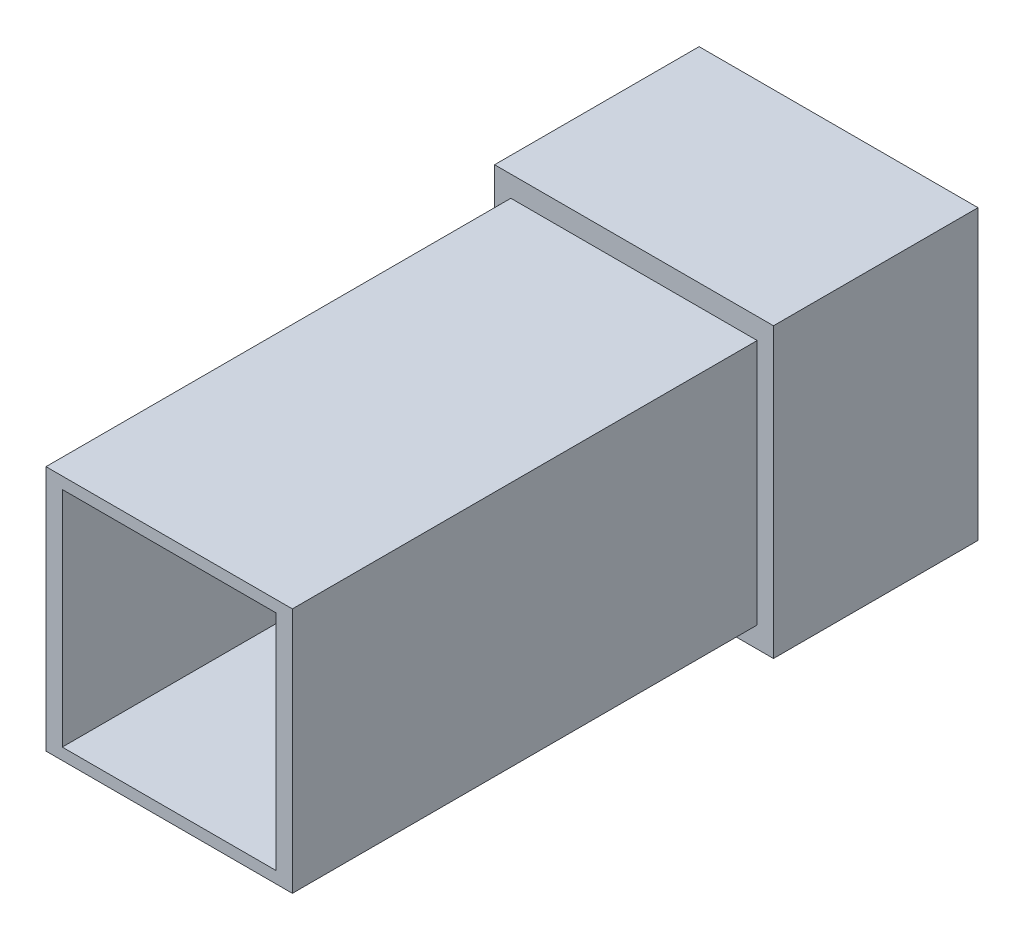
ISO-10303-21;
HEADER;
FILE_DESCRIPTION(('STEP AP214'),'2;1');
FILE_NAME('part.step','',(''),(''),'','','');
FILE_SCHEMA(('AUTOMOTIVE_DESIGN { 1 0 10303 214 1 1 1 1 }'));
ENDSEC;
DATA;
#1=APPLICATION_CONTEXT('core data for automotive mechanical design processes');
#2=APPLICATION_PROTOCOL_DEFINITION('international standard','automotive_design',2000,#1);
#3=PRODUCT_CONTEXT('',#1,'mechanical');
#4=PRODUCT('Part','Part','',(#3));
#5=PRODUCT_RELATED_PRODUCT_CATEGORY('part','',(#4));
#6=PRODUCT_DEFINITION_FORMATION('','',#4);
#7=PRODUCT_DEFINITION_CONTEXT('part definition',#1,'design');
#8=PRODUCT_DEFINITION('design','',#6,#7);
#9=PRODUCT_DEFINITION_SHAPE('','',#8);
#10=(LENGTH_UNIT() NAMED_UNIT(*) SI_UNIT(.MILLI.,.METRE.));
#11=(NAMED_UNIT(*) PLANE_ANGLE_UNIT() SI_UNIT($,.RADIAN.));
#12=(NAMED_UNIT(*) SI_UNIT($,.STERADIAN.) SOLID_ANGLE_UNIT());
#13=UNCERTAINTY_MEASURE_WITH_UNIT(LENGTH_MEASURE(1.E-05),#10,'distance_accuracy_value','');
#14=(GEOMETRIC_REPRESENTATION_CONTEXT(3) GLOBAL_UNCERTAINTY_ASSIGNED_CONTEXT((#13)) GLOBAL_UNIT_ASSIGNED_CONTEXT((#10,
#11,#12)) REPRESENTATION_CONTEXT('',''));
#15=CARTESIAN_POINT('',(0.,0.,0.));
#16=DIRECTION('',(0.,0.,1.));
#17=DIRECTION('',(1.,0.,0.));
#18=AXIS2_PLACEMENT_3D('',#15,#16,#17);
#19=CARTESIAN_POINT('',(0.,0.,55.88));
#20=DIRECTION('',(0.,0.,1.));
#21=DIRECTION('',(1.,0.,0.));
#22=AXIS2_PLACEMENT_3D('',#19,#20,#21);
#23=PLANE('',#22);
#24=DIRECTION('',(0.,-1.,0.));
#25=VECTOR('',#24,1.);
#26=CARTESIAN_POINT('',(-3.81,74.93,55.88));
#27=LINE('',#26,#25);
#28=CARTESIAN_POINT('',(-3.81,74.93,55.88));
#29=VERTEX_POINT('',#28);
#30=CARTESIAN_POINT('',(-3.81,-3.81,55.88));
#31=VERTEX_POINT('',#30);
#32=EDGE_CURVE('E340',#29,#31,#27,.T.);
#33=ORIENTED_EDGE('',*,*,#32,.T.);
#34=DIRECTION('',(1.,0.,0.));
#35=VECTOR('',#34,1.);
#36=CARTESIAN_POINT('',(-3.81,-3.81,55.88));
#37=LINE('',#36,#35);
#38=CARTESIAN_POINT('',(72.39,-3.81,55.88));
#39=VERTEX_POINT('',#38);
#40=EDGE_CURVE('E344',#31,#39,#37,.T.);
#41=ORIENTED_EDGE('',*,*,#40,.T.);
#42=DIRECTION('',(0.,1.,0.));
#43=VECTOR('',#42,1.);
#44=CARTESIAN_POINT('',(72.39,74.93,55.88));
#45=LINE('',#44,#43);
#46=CARTESIAN_POINT('',(72.39,74.93,55.88));
#47=VERTEX_POINT('',#46);
#48=EDGE_CURVE('E348',#39,#47,#45,.T.);
#49=ORIENTED_EDGE('',*,*,#48,.T.);
#50=DIRECTION('',(-1.,0.,0.));
#51=VECTOR('',#50,1.);
#52=CARTESIAN_POINT('',(-3.81,74.93,55.88));
#53=LINE('',#52,#51);
#54=EDGE_CURVE('E352',#47,#29,#53,.T.);
#55=ORIENTED_EDGE('',*,*,#54,.T.);
#56=EDGE_LOOP('',(#33,#41,#49,#55));
#57=FACE_BOUND('',#56,.T.);
#58=DIRECTION('',(1.,0.,0.));
#59=VECTOR('',#58,1.);
#60=CARTESIAN_POINT('',(0.634999999999986,1.90500000000001,55.88));
#61=LINE('',#60,#59);
#62=CARTESIAN_POINT('',(0.634999999999986,1.90500000000001,55.88));
#63=VERTEX_POINT('',#62);
#64=CARTESIAN_POINT('',(67.945,1.905,55.88));
#65=VERTEX_POINT('',#64);
#66=EDGE_CURVE('E260',#63,#65,#61,.T.);
#67=ORIENTED_EDGE('',*,*,#66,.F.);
#68=DIRECTION('',(0.,-1.,0.));
#69=VECTOR('',#68,1.);
#70=CARTESIAN_POINT('',(0.634999999999999,69.215,55.88));
#71=LINE('',#70,#69);
#72=CARTESIAN_POINT('',(0.634999999999999,69.215,55.88));
#73=VERTEX_POINT('',#72);
#74=EDGE_CURVE('E241',#73,#63,#71,.T.);
#75=ORIENTED_EDGE('',*,*,#74,.F.);
#76=DIRECTION('',(-1.,0.,0.));
#77=VECTOR('',#76,1.);
#78=CARTESIAN_POINT('',(0.634999999999999,69.215,55.88));
#79=LINE('',#78,#77);
#80=CARTESIAN_POINT('',(67.945,69.215,55.88));
#81=VERTEX_POINT('',#80);
#82=EDGE_CURVE('E247',#81,#73,#79,.T.);
#83=ORIENTED_EDGE('',*,*,#82,.F.);
#84=DIRECTION('',(0.,1.,0.));
#85=VECTOR('',#84,1.);
#86=CARTESIAN_POINT('',(67.945,69.215,55.88));
#87=LINE('',#86,#85);
#88=EDGE_CURVE('E263',#65,#81,#87,.T.);
#89=ORIENTED_EDGE('',*,*,#88,.F.);
#90=EDGE_LOOP('',(#67,#75,#83,#89));
#91=FACE_BOUND('',#90,.T.);
#92=ADVANCED_FACE('F67',(#57,#91),#23,.T.);
#93=CARTESIAN_POINT('',(68.58,0.,50.8));
#94=DIRECTION('',(-1.,0.,0.));
#95=DIRECTION('',(0.,0.,1.));
#96=AXIS2_PLACEMENT_3D('',#93,#94,#95);
#97=PLANE('',#96);
#98=DIRECTION('',(0.,1.,0.));
#99=VECTOR('',#98,1.);
#100=CARTESIAN_POINT('',(68.58,0.,0.));
#101=LINE('',#100,#99);
#102=CARTESIAN_POINT('',(68.58,0.,0.));
#103=VERTEX_POINT('',#102);
#104=CARTESIAN_POINT('',(68.58,71.12,0.));
#105=VERTEX_POINT('',#104);
#106=EDGE_CURVE('E388',#103,#105,#101,.T.);
#107=ORIENTED_EDGE('',*,*,#106,.F.);
#108=DIRECTION('',(0.,0.,-1.));
#109=VECTOR('',#108,1.);
#110=CARTESIAN_POINT('',(68.58,0.,50.8));
#111=LINE('',#110,#109);
#112=CARTESIAN_POINT('',(68.58,0.,50.8));
#113=VERTEX_POINT('',#112);
#114=EDGE_CURVE('E12',#113,#103,#111,.T.);
#115=ORIENTED_EDGE('',*,*,#114,.F.);
#116=DIRECTION('',(0.,1.,0.));
#117=VECTOR('',#116,1.);
#118=CARTESIAN_POINT('',(68.58,0.,50.8));
#119=LINE('',#118,#117);
#120=CARTESIAN_POINT('',(68.58,71.12,50.8));
#121=VERTEX_POINT('',#120);
#122=EDGE_CURVE('E357',#113,#121,#119,.T.);
#123=ORIENTED_EDGE('',*,*,#122,.T.);
#124=DIRECTION('',(0.,0.,-1.));
#125=VECTOR('',#124,1.);
#126=CARTESIAN_POINT('',(68.58,71.12,50.8));
#127=LINE('',#126,#125);
#128=EDGE_CURVE('E403',#121,#105,#127,.T.);
#129=ORIENTED_EDGE('',*,*,#128,.T.);
#130=EDGE_LOOP('',(#107,#115,#123,#129));
#131=FACE_BOUND('',#130,.T.);
#132=ADVANCED_FACE('F441',(#131),#97,.T.);
#133=CARTESIAN_POINT('',(0.,0.,50.8));
#134=DIRECTION('',(0.,1.,0.));
#135=DIRECTION('',(0.,0.,1.));
#136=AXIS2_PLACEMENT_3D('',#133,#134,#135);
#137=PLANE('',#136);
#138=DIRECTION('',(1.,0.,0.));
#139=VECTOR('',#138,1.);
#140=CARTESIAN_POINT('',(0.,0.,0.));
#141=LINE('',#140,#139);
#142=CARTESIAN_POINT('',(0.,0.,0.));
#143=VERTEX_POINT('',#142);
#144=EDGE_CURVE('E392',#143,#103,#141,.T.);
#145=ORIENTED_EDGE('',*,*,#144,.F.);
#146=DIRECTION('',(0.,0.,-1.));
#147=VECTOR('',#146,1.);
#148=CARTESIAN_POINT('',(0.,0.,50.8));
#149=LINE('',#148,#147);
#150=CARTESIAN_POINT('',(0.,0.,50.8));
#151=VERTEX_POINT('',#150);
#152=EDGE_CURVE('E77',#151,#143,#149,.T.);
#153=ORIENTED_EDGE('',*,*,#152,.F.);
#154=DIRECTION('',(1.,0.,0.));
#155=VECTOR('',#154,1.);
#156=CARTESIAN_POINT('',(0.,0.,50.8));
#157=LINE('',#156,#155);
#158=EDGE_CURVE('E360',#151,#113,#157,.T.);
#159=ORIENTED_EDGE('',*,*,#158,.T.);
#160=ORIENTED_EDGE('',*,*,#114,.T.);
#161=EDGE_LOOP('',(#145,#153,#159,#160));
#162=FACE_BOUND('',#161,.T.);
#163=ADVANCED_FACE('F516',(#162),#137,.T.);
#164=CARTESIAN_POINT('',(0.,0.,50.8));
#165=DIRECTION('',(-1.,0.,0.));
#166=DIRECTION('',(0.,0.,1.));
#167=AXIS2_PLACEMENT_3D('',#164,#165,#166);
#168=PLANE('',#167);
#169=DIRECTION('',(0.,1.,0.));
#170=VECTOR('',#169,1.);
#171=CARTESIAN_POINT('',(0.,0.,0.));
#172=LINE('',#171,#170);
#173=CARTESIAN_POINT('',(0.,71.12,0.));
#174=VERTEX_POINT('',#173);
#175=EDGE_CURVE('E396',#143,#174,#172,.T.);
#176=ORIENTED_EDGE('',*,*,#175,.T.);
#177=DIRECTION('',(0.,0.,-1.));
#178=VECTOR('',#177,1.);
#179=CARTESIAN_POINT('',(0.,71.12,50.8));
#180=LINE('',#179,#178);
#181=CARTESIAN_POINT('',(0.,71.12,50.8));
#182=VERTEX_POINT('',#181);
#183=EDGE_CURVE('E406',#182,#174,#180,.T.);
#184=ORIENTED_EDGE('',*,*,#183,.F.);
#185=DIRECTION('',(0.,1.,0.));
#186=VECTOR('',#185,1.);
#187=CARTESIAN_POINT('',(0.,0.,50.8));
#188=LINE('',#187,#186);
#189=EDGE_CURVE('E365',#151,#182,#188,.T.);
#190=ORIENTED_EDGE('',*,*,#189,.F.);
#191=ORIENTED_EDGE('',*,*,#152,.T.);
#192=EDGE_LOOP('',(#176,#184,#190,#191));
#193=FACE_BOUND('',#192,.T.);
#194=ADVANCED_FACE('F513',(#193),#168,.F.);
#195=CARTESIAN_POINT('',(72.39,0.,50.8));
#196=DIRECTION('',(1.,0.,0.));
#197=DIRECTION('',(0.,1.,0.));
#198=AXIS2_PLACEMENT_3D('',#195,#196,#197);
#199=PLANE('',#198);
#200=DIRECTION('',(0.,-1.,0.));
#201=VECTOR('',#200,1.);
#202=CARTESIAN_POINT('',(72.39,0.,0.));
#203=LINE('',#202,#201);
#204=CARTESIAN_POINT('',(72.39,74.93,0.));
#205=VERTEX_POINT('',#204);
#206=CARTESIAN_POINT('',(72.39,-3.81,0.));
#207=VERTEX_POINT('',#206);
#208=EDGE_CURVE('E356',#205,#207,#203,.T.);
#209=ORIENTED_EDGE('',*,*,#208,.F.);
#210=DIRECTION('',(0.,0.,-1.));
#211=VECTOR('',#210,1.);
#212=CARTESIAN_POINT('',(72.39,74.93,50.8));
#213=LINE('',#212,#211);
#214=EDGE_CURVE('E71',#47,#205,#213,.T.);
#215=ORIENTED_EDGE('',*,*,#214,.F.);
#216=ORIENTED_EDGE('',*,*,#48,.F.);
#217=DIRECTION('',(0.,0.,-1.));
#218=VECTOR('',#217,1.);
#219=CARTESIAN_POINT('',(72.39,-3.81,50.8));
#220=LINE('',#219,#218);
#221=EDGE_CURVE('E373',#39,#207,#220,.T.);
#222=ORIENTED_EDGE('',*,*,#221,.T.);
#223=EDGE_LOOP('',(#209,#215,#216,#222));
#224=FACE_BOUND('',#223,.T.);
#225=ADVANCED_FACE('F69',(#224),#199,.T.);
#226=CARTESIAN_POINT('',(0.,74.93,50.8));
#227=DIRECTION('',(0.,1.,0.));
#228=DIRECTION('',(0.,0.,1.));
#229=AXIS2_PLACEMENT_3D('',#226,#227,#228);
#230=PLANE('',#229);
#231=DIRECTION('',(1.,0.,0.));
#232=VECTOR('',#231,1.);
#233=CARTESIAN_POINT('',(0.,74.93,0.));
#234=LINE('',#233,#232);
#235=CARTESIAN_POINT('',(-3.81,74.93,0.));
#236=VERTEX_POINT('',#235);
#237=EDGE_CURVE('E377',#236,#205,#234,.T.);
#238=ORIENTED_EDGE('',*,*,#237,.F.);
#239=DIRECTION('',(0.,0.,-1.));
#240=VECTOR('',#239,1.);
#241=CARTESIAN_POINT('',(-3.81,74.93,50.8));
#242=LINE('',#241,#240);
#243=EDGE_CURVE('E417',#29,#236,#242,.T.);
#244=ORIENTED_EDGE('',*,*,#243,.F.);
#245=ORIENTED_EDGE('',*,*,#54,.F.);
#246=ORIENTED_EDGE('',*,*,#214,.T.);
#247=EDGE_LOOP('',(#238,#244,#245,#246));
#248=FACE_BOUND('',#247,.T.);
#249=ADVANCED_FACE('F427',(#248),#230,.T.);
#250=CARTESIAN_POINT('',(-3.80999999999999,0.,50.8));
#251=DIRECTION('',(1.,0.,0.));
#252=DIRECTION('',(0.,1.,0.));
#253=AXIS2_PLACEMENT_3D('',#250,#251,#252);
#254=PLANE('',#253);
#255=DIRECTION('',(0.,-1.,0.));
#256=VECTOR('',#255,1.);
#257=CARTESIAN_POINT('',(-3.80999999999999,0.,0.));
#258=LINE('',#257,#256);
#259=CARTESIAN_POINT('',(-3.80999999999999,-3.81,0.));
#260=VERTEX_POINT('',#259);
#261=EDGE_CURVE('E381',#236,#260,#258,.T.);
#262=ORIENTED_EDGE('',*,*,#261,.T.);
#263=DIRECTION('',(0.,0.,-1.));
#264=VECTOR('',#263,1.);
#265=CARTESIAN_POINT('',(-3.80999999999999,-3.81,50.8));
#266=LINE('',#265,#264);
#267=EDGE_CURVE('E414',#31,#260,#266,.T.);
#268=ORIENTED_EDGE('',*,*,#267,.F.);
#269=ORIENTED_EDGE('',*,*,#32,.F.);
#270=ORIENTED_EDGE('',*,*,#243,.T.);
#271=EDGE_LOOP('',(#262,#268,#269,#270));
#272=FACE_BOUND('',#271,.T.);
#273=ADVANCED_FACE('F434',(#272),#254,.F.);
#274=CARTESIAN_POINT('',(0.,-3.81,50.8));
#275=DIRECTION('',(0.,1.,0.));
#276=DIRECTION('',(0.,0.,1.));
#277=AXIS2_PLACEMENT_3D('',#274,#275,#276);
#278=PLANE('',#277);
#279=DIRECTION('',(1.,0.,0.));
#280=VECTOR('',#279,1.);
#281=CARTESIAN_POINT('',(0.,-3.81,0.));
#282=LINE('',#281,#280);
#283=EDGE_CURVE('E384',#260,#207,#282,.T.);
#284=ORIENTED_EDGE('',*,*,#283,.T.);
#285=ORIENTED_EDGE('',*,*,#221,.F.);
#286=ORIENTED_EDGE('',*,*,#40,.F.);
#287=ORIENTED_EDGE('',*,*,#267,.T.);
#288=EDGE_LOOP('',(#284,#285,#286,#287));
#289=FACE_BOUND('',#288,.T.);
#290=ADVANCED_FACE('F437',(#289),#278,.F.);
#291=CARTESIAN_POINT('',(0.,71.12,50.8));
#292=DIRECTION('',(0.,1.,0.));
#293=DIRECTION('',(0.,0.,1.));
#294=AXIS2_PLACEMENT_3D('',#291,#292,#293);
#295=PLANE('',#294);
#296=DIRECTION('',(1.,0.,0.));
#297=VECTOR('',#296,1.);
#298=CARTESIAN_POINT('',(0.,71.12,0.));
#299=LINE('',#298,#297);
#300=EDGE_CURVE('E361',#174,#105,#299,.T.);
#301=ORIENTED_EDGE('',*,*,#300,.T.);
#302=ORIENTED_EDGE('',*,*,#128,.F.);
#303=DIRECTION('',(1.,0.,0.));
#304=VECTOR('',#303,1.);
#305=CARTESIAN_POINT('',(0.,71.12,50.8));
#306=LINE('',#305,#304);
#307=EDGE_CURVE('E369',#182,#121,#306,.T.);
#308=ORIENTED_EDGE('',*,*,#307,.F.);
#309=ORIENTED_EDGE('',*,*,#183,.T.);
#310=EDGE_LOOP('',(#301,#302,#308,#309));
#311=FACE_BOUND('',#310,.T.);
#312=ADVANCED_FACE('F509',(#311),#295,.F.);
#313=CARTESIAN_POINT('',(0.,0.,0.));
#314=DIRECTION('',(0.,0.,1.));
#315=DIRECTION('',(1.,0.,0.));
#316=AXIS2_PLACEMENT_3D('',#313,#314,#315);
#317=PLANE('',#316);
#318=ORIENTED_EDGE('',*,*,#208,.T.);
#319=ORIENTED_EDGE('',*,*,#283,.F.);
#320=ORIENTED_EDGE('',*,*,#261,.F.);
#321=ORIENTED_EDGE('',*,*,#237,.T.);
#322=EDGE_LOOP('',(#318,#319,#320,#321));
#323=FACE_BOUND('',#322,.T.);
#324=ORIENTED_EDGE('',*,*,#106,.T.);
#325=ORIENTED_EDGE('',*,*,#300,.F.);
#326=ORIENTED_EDGE('',*,*,#175,.F.);
#327=ORIENTED_EDGE('',*,*,#144,.T.);
#328=EDGE_LOOP('',(#324,#325,#326,#327));
#329=FACE_BOUND('',#328,.T.);
#330=ADVANCED_FACE('F432',(#323,#329),#317,.F.);
#331=CARTESIAN_POINT('',(0.,0.,50.8));
#332=DIRECTION('',(0.,0.,1.));
#333=DIRECTION('',(1.,0.,0.));
#334=AXIS2_PLACEMENT_3D('',#331,#332,#333);
#335=PLANE('',#334);
#336=DIRECTION('',(1.,0.,0.));
#337=VECTOR('',#336,1.);
#338=CARTESIAN_POINT('',(0.,2.54,50.8));
#339=LINE('',#338,#337);
#340=CARTESIAN_POINT('',(2.54,2.54,50.8));
#341=VERTEX_POINT('',#340);
#342=CARTESIAN_POINT('',(66.04,2.54,50.8));
#343=VERTEX_POINT('',#342);
#344=EDGE_CURVE('E291',#341,#343,#339,.T.);
#345=ORIENTED_EDGE('',*,*,#344,.T.);
#346=DIRECTION('',(0.,-1.,0.));
#347=VECTOR('',#346,1.);
#348=CARTESIAN_POINT('',(66.04,0.,50.8));
#349=LINE('',#348,#347);
#350=CARTESIAN_POINT('',(66.04,68.58,50.8));
#351=VERTEX_POINT('',#350);
#352=EDGE_CURVE('E93',#351,#343,#349,.T.);
#353=ORIENTED_EDGE('',*,*,#352,.F.);
#354=DIRECTION('',(1.,0.,0.));
#355=VECTOR('',#354,1.);
#356=CARTESIAN_POINT('',(0.,68.58,50.8));
#357=LINE('',#356,#355);
#358=CARTESIAN_POINT('',(2.54,68.58,50.8));
#359=VERTEX_POINT('',#358);
#360=EDGE_CURVE('E283',#359,#351,#357,.T.);
#361=ORIENTED_EDGE('',*,*,#360,.F.);
#362=DIRECTION('',(0.,-1.,0.));
#363=VECTOR('',#362,1.);
#364=CARTESIAN_POINT('',(2.54,0.,50.8));
#365=LINE('',#364,#363);
#366=EDGE_CURVE('E288',#359,#341,#365,.T.);
#367=ORIENTED_EDGE('',*,*,#366,.T.);
#368=EDGE_LOOP('',(#345,#353,#361,#367));
#369=FACE_BOUND('',#368,.T.);
#370=ORIENTED_EDGE('',*,*,#122,.F.);
#371=ORIENTED_EDGE('',*,*,#158,.F.);
#372=ORIENTED_EDGE('',*,*,#189,.T.);
#373=ORIENTED_EDGE('',*,*,#307,.T.);
#374=EDGE_LOOP('',(#370,#371,#372,#373));
#375=FACE_BOUND('',#374,.T.);
#376=ADVANCED_FACE('F502',(#369,#375),#335,.F.);
#377=CARTESIAN_POINT('',(63.5,5.08,55.88));
#378=DIRECTION('',(-1.,0.,0.));
#379=DIRECTION('',(0.,0.,1.));
#380=AXIS2_PLACEMENT_3D('',#377,#378,#379);
#381=PLANE('',#380);
#382=DIRECTION('',(0.,0.,-1.));
#383=VECTOR('',#382,1.);
#384=CARTESIAN_POINT('',(63.5,66.04,55.88));
#385=LINE('',#384,#383);
#386=CARTESIAN_POINT('',(63.5,66.04,182.88));
#387=VERTEX_POINT('',#386);
#388=CARTESIAN_POINT('',(63.5,66.04,0.));
#389=VERTEX_POINT('',#388);
#390=EDGE_CURVE('E337',#387,#389,#385,.T.);
#391=ORIENTED_EDGE('',*,*,#390,.T.);
#392=DIRECTION('',(0.,-1.,0.));
#393=VECTOR('',#392,1.);
#394=CARTESIAN_POINT('',(63.5,0.,0.));
#395=LINE('',#394,#393);
#396=CARTESIAN_POINT('',(63.5,5.08,0.));
#397=VERTEX_POINT('',#396);
#398=EDGE_CURVE('E313',#389,#397,#395,.T.);
#399=ORIENTED_EDGE('',*,*,#398,.T.);
#400=DIRECTION('',(0.,0.,-1.));
#401=VECTOR('',#400,1.);
#402=CARTESIAN_POINT('',(63.5,5.08,55.88));
#403=LINE('',#402,#401);
#404=CARTESIAN_POINT('',(63.5,5.08,182.88));
#405=VERTEX_POINT('',#404);
#406=EDGE_CURVE('E220',#405,#397,#403,.T.);
#407=ORIENTED_EDGE('',*,*,#406,.F.);
#408=DIRECTION('',(0.,1.,0.));
#409=VECTOR('',#408,1.);
#410=CARTESIAN_POINT('',(63.5,66.04,182.88));
#411=LINE('',#410,#409);
#412=EDGE_CURVE('E232',#405,#387,#411,.T.);
#413=ORIENTED_EDGE('',*,*,#412,.T.);
#414=EDGE_LOOP('',(#391,#399,#407,#413));
#415=FACE_BOUND('',#414,.T.);
#416=ADVANCED_FACE('F499',(#415),#381,.T.);
#417=CARTESIAN_POINT('',(63.5,66.04,55.88));
#418=DIRECTION('',(0.,-1.,0.));
#419=DIRECTION('',(0.,0.,-1.));
#420=AXIS2_PLACEMENT_3D('',#417,#418,#419);
#421=PLANE('',#420);
#422=DIRECTION('',(0.,0.,-1.));
#423=VECTOR('',#422,1.);
#424=CARTESIAN_POINT('',(5.07999999999999,66.04,55.88));
#425=LINE('',#424,#423);
#426=CARTESIAN_POINT('',(5.07999999999999,66.04,182.88));
#427=VERTEX_POINT('',#426);
#428=CARTESIAN_POINT('',(5.07999999999999,66.04,0.));
#429=VERTEX_POINT('',#428);
#430=EDGE_CURVE('E219',#427,#429,#425,.T.);
#431=ORIENTED_EDGE('',*,*,#430,.T.);
#432=DIRECTION('',(1.,0.,0.));
#433=VECTOR('',#432,1.);
#434=CARTESIAN_POINT('',(0.,66.04,0.));
#435=LINE('',#434,#433);
#436=EDGE_CURVE('E309',#429,#389,#435,.T.);
#437=ORIENTED_EDGE('',*,*,#436,.T.);
#438=ORIENTED_EDGE('',*,*,#390,.F.);
#439=DIRECTION('',(-1.,0.,0.));
#440=VECTOR('',#439,1.);
#441=CARTESIAN_POINT('',(5.07999999999999,66.04,182.88));
#442=LINE('',#441,#440);
#443=EDGE_CURVE('E236',#387,#427,#442,.T.);
#444=ORIENTED_EDGE('',*,*,#443,.T.);
#445=EDGE_LOOP('',(#431,#437,#438,#444));
#446=FACE_BOUND('',#445,.T.);
#447=ADVANCED_FACE('F496',(#446),#421,.T.);
#448=CARTESIAN_POINT('',(5.07999999999999,5.08,55.88));
#449=DIRECTION('',(1.,0.,0.));
#450=DIRECTION('',(0.,0.,-1.));
#451=AXIS2_PLACEMENT_3D('',#448,#449,#450);
#452=PLANE('',#451);
#453=DIRECTION('',(0.,0.,-1.));
#454=VECTOR('',#453,1.);
#455=CARTESIAN_POINT('',(5.07999999999999,5.08,55.88));
#456=LINE('',#455,#454);
#457=CARTESIAN_POINT('',(5.07999999999999,5.08,182.88));
#458=VERTEX_POINT('',#457);
#459=CARTESIAN_POINT('',(5.08,5.08,0.));
#460=VERTEX_POINT('',#459);
#461=EDGE_CURVE('E207',#458,#460,#456,.T.);
#462=ORIENTED_EDGE('',*,*,#461,.T.);
#463=DIRECTION('',(0.,-1.,0.));
#464=VECTOR('',#463,1.);
#465=CARTESIAN_POINT('',(5.08,0.,0.));
#466=LINE('',#465,#464);
#467=EDGE_CURVE('E284',#429,#460,#466,.T.);
#468=ORIENTED_EDGE('',*,*,#467,.F.);
#469=ORIENTED_EDGE('',*,*,#430,.F.);
#470=DIRECTION('',(0.,-1.,0.));
#471=VECTOR('',#470,1.);
#472=CARTESIAN_POINT('',(5.07999999999999,66.04,182.88));
#473=LINE('',#472,#471);
#474=EDGE_CURVE('E223',#427,#458,#473,.T.);
#475=ORIENTED_EDGE('',*,*,#474,.T.);
#476=EDGE_LOOP('',(#462,#468,#469,#475));
#477=FACE_BOUND('',#476,.T.);
#478=ADVANCED_FACE('F224',(#477),#452,.T.);
#479=CARTESIAN_POINT('',(63.5,5.08,55.88));
#480=DIRECTION('',(0.,1.,0.));
#481=DIRECTION('',(0.,0.,1.));
#482=AXIS2_PLACEMENT_3D('',#479,#480,#481);
#483=PLANE('',#482);
#484=ORIENTED_EDGE('',*,*,#406,.T.);
#485=DIRECTION('',(1.,0.,0.));
#486=VECTOR('',#485,1.);
#487=CARTESIAN_POINT('',(0.,5.08,0.));
#488=LINE('',#487,#486);
#489=EDGE_CURVE('E214',#460,#397,#488,.T.);
#490=ORIENTED_EDGE('',*,*,#489,.F.);
#491=ORIENTED_EDGE('',*,*,#461,.F.);
#492=DIRECTION('',(1.,0.,0.));
#493=VECTOR('',#492,1.);
#494=CARTESIAN_POINT('',(5.07999999999999,5.08,182.88));
#495=LINE('',#494,#493);
#496=EDGE_CURVE('E211',#458,#405,#495,.T.);
#497=ORIENTED_EDGE('',*,*,#496,.T.);
#498=EDGE_LOOP('',(#484,#490,#491,#497));
#499=FACE_BOUND('',#498,.T.);
#500=ADVANCED_FACE('F209',(#499),#483,.T.);
#501=CARTESIAN_POINT('',(66.04,0.,50.8));
#502=DIRECTION('',(1.,0.,0.));
#503=DIRECTION('',(0.,0.,-1.));
#504=AXIS2_PLACEMENT_3D('',#501,#502,#503);
#505=PLANE('',#504);
#506=DIRECTION('',(0.,-1.,0.));
#507=VECTOR('',#506,1.);
#508=CARTESIAN_POINT('',(66.04,0.,0.));
#509=LINE('',#508,#507);
#510=CARTESIAN_POINT('',(66.04,68.58,0.));
#511=VERTEX_POINT('',#510);
#512=CARTESIAN_POINT('',(66.04,2.54,0.));
#513=VERTEX_POINT('',#512);
#514=EDGE_CURVE('E280',#511,#513,#509,.T.);
#515=ORIENTED_EDGE('',*,*,#514,.F.);
#516=DIRECTION('',(0.,0.,-1.));
#517=VECTOR('',#516,1.);
#518=CARTESIAN_POINT('',(66.04,68.58,50.8));
#519=LINE('',#518,#517);
#520=EDGE_CURVE('E330',#351,#511,#519,.T.);
#521=ORIENTED_EDGE('',*,*,#520,.F.);
#522=ORIENTED_EDGE('',*,*,#352,.T.);
#523=DIRECTION('',(0.,0.,-1.));
#524=VECTOR('',#523,1.);
#525=CARTESIAN_POINT('',(66.04,2.54,50.8));
#526=LINE('',#525,#524);
#527=EDGE_CURVE('E294',#343,#513,#526,.T.);
#528=ORIENTED_EDGE('',*,*,#527,.T.);
#529=EDGE_LOOP('',(#515,#521,#522,#528));
#530=FACE_BOUND('',#529,.T.);
#531=ADVANCED_FACE('F487',(#530),#505,.T.);
#532=CARTESIAN_POINT('',(0.,68.58,50.8));
#533=DIRECTION('',(0.,1.,0.));
#534=DIRECTION('',(0.,0.,1.));
#535=AXIS2_PLACEMENT_3D('',#532,#533,#534);
#536=PLANE('',#535);
#537=DIRECTION('',(1.,0.,0.));
#538=VECTOR('',#537,1.);
#539=CARTESIAN_POINT('',(0.,68.58,0.));
#540=LINE('',#539,#538);
#541=CARTESIAN_POINT('',(2.54,68.58,0.));
#542=VERTEX_POINT('',#541);
#543=EDGE_CURVE('E298',#542,#511,#540,.T.);
#544=ORIENTED_EDGE('',*,*,#543,.F.);
#545=DIRECTION('',(0.,0.,-1.));
#546=VECTOR('',#545,1.);
#547=CARTESIAN_POINT('',(2.54,68.58,50.8));
#548=LINE('',#547,#546);
#549=EDGE_CURVE('E327',#359,#542,#548,.T.);
#550=ORIENTED_EDGE('',*,*,#549,.F.);
#551=ORIENTED_EDGE('',*,*,#360,.T.);
#552=ORIENTED_EDGE('',*,*,#520,.T.);
#553=EDGE_LOOP('',(#544,#550,#551,#552));
#554=FACE_BOUND('',#553,.T.);
#555=ADVANCED_FACE('F483',(#554),#536,.T.);
#556=CARTESIAN_POINT('',(2.54,0.,50.8));
#557=DIRECTION('',(1.,0.,0.));
#558=DIRECTION('',(0.,0.,-1.));
#559=AXIS2_PLACEMENT_3D('',#556,#557,#558);
#560=PLANE('',#559);
#561=DIRECTION('',(0.,-1.,0.));
#562=VECTOR('',#561,1.);
#563=CARTESIAN_POINT('',(2.54,0.,0.));
#564=LINE('',#563,#562);
#565=CARTESIAN_POINT('',(2.54,2.54,0.));
#566=VERTEX_POINT('',#565);
#567=EDGE_CURVE('E302',#542,#566,#564,.T.);
#568=ORIENTED_EDGE('',*,*,#567,.T.);
#569=DIRECTION('',(0.,0.,-1.));
#570=VECTOR('',#569,1.);
#571=CARTESIAN_POINT('',(2.54,2.54,50.8));
#572=LINE('',#571,#570);
#573=EDGE_CURVE('E323',#341,#566,#572,.T.);
#574=ORIENTED_EDGE('',*,*,#573,.F.);
#575=ORIENTED_EDGE('',*,*,#366,.F.);
#576=ORIENTED_EDGE('',*,*,#549,.T.);
#577=EDGE_LOOP('',(#568,#574,#575,#576));
#578=FACE_BOUND('',#577,.T.);
#579=ADVANCED_FACE('F479',(#578),#560,.F.);
#580=CARTESIAN_POINT('',(0.,2.54,50.8));
#581=DIRECTION('',(0.,1.,0.));
#582=DIRECTION('',(0.,0.,1.));
#583=AXIS2_PLACEMENT_3D('',#580,#581,#582);
#584=PLANE('',#583);
#585=DIRECTION('',(1.,0.,0.));
#586=VECTOR('',#585,1.);
#587=CARTESIAN_POINT('',(0.,2.54,0.));
#588=LINE('',#587,#586);
#589=EDGE_CURVE('E305',#566,#513,#588,.T.);
#590=ORIENTED_EDGE('',*,*,#589,.T.);
#591=ORIENTED_EDGE('',*,*,#527,.F.);
#592=ORIENTED_EDGE('',*,*,#344,.F.);
#593=ORIENTED_EDGE('',*,*,#573,.T.);
#594=EDGE_LOOP('',(#590,#591,#592,#593));
#595=FACE_BOUND('',#594,.T.);
#596=ADVANCED_FACE('F475',(#595),#584,.F.);
#597=CARTESIAN_POINT('',(0.,0.,0.));
#598=DIRECTION('',(0.,0.,1.));
#599=DIRECTION('',(1.,0.,0.));
#600=AXIS2_PLACEMENT_3D('',#597,#598,#599);
#601=PLANE('',#600);
#602=ORIENTED_EDGE('',*,*,#514,.T.);
#603=ORIENTED_EDGE('',*,*,#589,.F.);
#604=ORIENTED_EDGE('',*,*,#567,.F.);
#605=ORIENTED_EDGE('',*,*,#543,.T.);
#606=EDGE_LOOP('',(#602,#603,#604,#605));
#607=FACE_BOUND('',#606,.T.);
#608=ORIENTED_EDGE('',*,*,#436,.F.);
#609=ORIENTED_EDGE('',*,*,#467,.T.);
#610=ORIENTED_EDGE('',*,*,#489,.T.);
#611=ORIENTED_EDGE('',*,*,#398,.F.);
#612=EDGE_LOOP('',(#608,#609,#610,#611));
#613=FACE_BOUND('',#612,.T.);
#614=ADVANCED_FACE('F472',(#607,#613),#601,.F.);
#615=CARTESIAN_POINT('',(0.,0.,182.88));
#616=DIRECTION('',(0.,0.,1.));
#617=DIRECTION('',(1.,0.,0.));
#618=AXIS2_PLACEMENT_3D('',#615,#616,#617);
#619=PLANE('',#618);
#620=DIRECTION('',(0.,-1.,0.));
#621=VECTOR('',#620,1.);
#622=CARTESIAN_POINT('',(0.634999999999999,69.215,182.88));
#623=LINE('',#622,#621);
#624=CARTESIAN_POINT('',(0.634999999999999,69.215,182.88));
#625=VERTEX_POINT('',#624);
#626=CARTESIAN_POINT('',(0.634999999999986,1.90500000000001,182.88));
#627=VERTEX_POINT('',#626);
#628=EDGE_CURVE('E242',#625,#627,#623,.T.);
#629=ORIENTED_EDGE('',*,*,#628,.T.);
#630=DIRECTION('',(1.,0.,0.));
#631=VECTOR('',#630,1.);
#632=CARTESIAN_POINT('',(0.634999999999986,1.90500000000001,182.88));
#633=LINE('',#632,#631);
#634=CARTESIAN_POINT('',(67.945,1.905,182.88));
#635=VERTEX_POINT('',#634);
#636=EDGE_CURVE('E246',#627,#635,#633,.T.);
#637=ORIENTED_EDGE('',*,*,#636,.T.);
#638=DIRECTION('',(0.,1.,0.));
#639=VECTOR('',#638,1.);
#640=CARTESIAN_POINT('',(67.945,69.215,182.88));
#641=LINE('',#640,#639);
#642=CARTESIAN_POINT('',(67.945,69.215,182.88));
#643=VERTEX_POINT('',#642);
#644=EDGE_CURVE('E250',#635,#643,#641,.T.);
#645=ORIENTED_EDGE('',*,*,#644,.T.);
#646=DIRECTION('',(-1.,0.,0.));
#647=VECTOR('',#646,1.);
#648=CARTESIAN_POINT('',(0.634999999999999,69.215,182.88));
#649=LINE('',#648,#647);
#650=EDGE_CURVE('E253',#643,#625,#649,.T.);
#651=ORIENTED_EDGE('',*,*,#650,.T.);
#652=EDGE_LOOP('',(#629,#637,#645,#651));
#653=FACE_BOUND('',#652,.T.);
#654=ORIENTED_EDGE('',*,*,#496,.F.);
#655=ORIENTED_EDGE('',*,*,#474,.F.);
#656=ORIENTED_EDGE('',*,*,#443,.F.);
#657=ORIENTED_EDGE('',*,*,#412,.F.);
#658=EDGE_LOOP('',(#654,#655,#656,#657));
#659=FACE_BOUND('',#658,.T.);
#660=ADVANCED_FACE('F230',(#653,#659),#619,.T.);
#661=CARTESIAN_POINT('',(0.634999999999999,69.215,182.88));
#662=DIRECTION('',(1.,0.,0.));
#663=DIRECTION('',(0.,1.,0.));
#664=AXIS2_PLACEMENT_3D('',#661,#662,#663);
#665=PLANE('',#664);
#666=ORIENTED_EDGE('',*,*,#74,.T.);
#667=DIRECTION('',(0.,0.,-1.));
#668=VECTOR('',#667,1.);
#669=CARTESIAN_POINT('',(0.634999999999986,1.90500000000001,182.88));
#670=LINE('',#669,#668);
#671=EDGE_CURVE('E277',#627,#63,#670,.T.);
#672=ORIENTED_EDGE('',*,*,#671,.F.);
#673=ORIENTED_EDGE('',*,*,#628,.F.);
#674=DIRECTION('',(0.,0.,-1.));
#675=VECTOR('',#674,1.);
#676=CARTESIAN_POINT('',(0.634999999999999,69.215,182.88));
#677=LINE('',#676,#675);
#678=EDGE_CURVE('E256',#625,#73,#677,.T.);
#679=ORIENTED_EDGE('',*,*,#678,.T.);
#680=EDGE_LOOP('',(#666,#672,#673,#679));
#681=FACE_BOUND('',#680,.T.);
#682=ADVANCED_FACE('F458',(#681),#665,.F.);
#683=CARTESIAN_POINT('',(0.634999999999986,1.90500000000001,182.88));
#684=DIRECTION('',(0.,1.,0.));
#685=DIRECTION('',(-1.,0.,0.));
#686=AXIS2_PLACEMENT_3D('',#683,#684,#685);
#687=PLANE('',#686);
#688=ORIENTED_EDGE('',*,*,#66,.T.);
#689=DIRECTION('',(0.,0.,-1.));
#690=VECTOR('',#689,1.);
#691=CARTESIAN_POINT('',(67.945,1.905,182.88));
#692=LINE('',#691,#690);
#693=EDGE_CURVE('E273',#635,#65,#692,.T.);
#694=ORIENTED_EDGE('',*,*,#693,.F.);
#695=ORIENTED_EDGE('',*,*,#636,.F.);
#696=ORIENTED_EDGE('',*,*,#671,.T.);
#697=EDGE_LOOP('',(#688,#694,#695,#696));
#698=FACE_BOUND('',#697,.T.);
#699=ADVANCED_FACE('F449',(#698),#687,.F.);
#700=CARTESIAN_POINT('',(67.945,69.215,182.88));
#701=DIRECTION('',(-1.,0.,0.));
#702=DIRECTION('',(0.,0.,1.));
#703=AXIS2_PLACEMENT_3D('',#700,#701,#702);
#704=PLANE('',#703);
#705=ORIENTED_EDGE('',*,*,#88,.T.);
#706=DIRECTION('',(0.,0.,-1.));
#707=VECTOR('',#706,1.);
#708=CARTESIAN_POINT('',(67.945,69.215,182.88));
#709=LINE('',#708,#707);
#710=EDGE_CURVE('E85',#643,#81,#709,.T.);
#711=ORIENTED_EDGE('',*,*,#710,.F.);
#712=ORIENTED_EDGE('',*,*,#644,.F.);
#713=ORIENTED_EDGE('',*,*,#693,.T.);
#714=EDGE_LOOP('',(#705,#711,#712,#713));
#715=FACE_BOUND('',#714,.T.);
#716=ADVANCED_FACE('F453',(#715),#704,.F.);
#717=CARTESIAN_POINT('',(0.634999999999999,69.215,182.88));
#718=DIRECTION('',(0.,-1.,0.));
#719=DIRECTION('',(0.,0.,-1.));
#720=AXIS2_PLACEMENT_3D('',#717,#718,#719);
#721=PLANE('',#720);
#722=ORIENTED_EDGE('',*,*,#82,.T.);
#723=ORIENTED_EDGE('',*,*,#678,.F.);
#724=ORIENTED_EDGE('',*,*,#650,.F.);
#725=ORIENTED_EDGE('',*,*,#710,.T.);
#726=EDGE_LOOP('',(#722,#723,#724,#725));
#727=FACE_BOUND('',#726,.T.);
#728=ADVANCED_FACE('F459',(#727),#721,.F.);
#729=CLOSED_SHELL('',(#92,#132,#163,#194,#225,#249,#273,#290,#312,#330,#376,#416,#447,#478,#500,
#531,#555,#579,#596,#614,#660,#682,#699,#716,#728));
#730=MANIFOLD_SOLID_BREP('B2',#729);
#731=ADVANCED_BREP_SHAPE_REPRESENTATION('',(#18,#730),#14);
#732=SHAPE_DEFINITION_REPRESENTATION(#9,#731);
ENDSEC;
END-ISO-10303-21;
